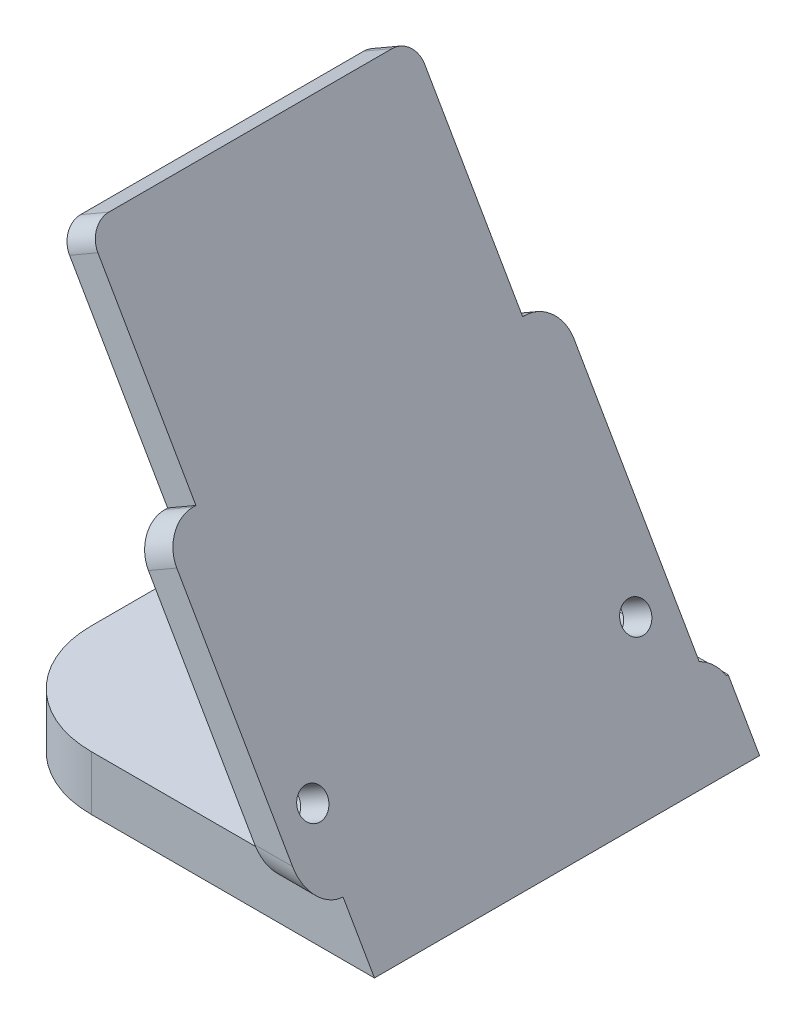
ISO-10303-21;
HEADER;
FILE_DESCRIPTION(('STEP AP214'),'2;1');
FILE_NAME('part.step','',(''),(''),'','','');
FILE_SCHEMA(('AUTOMOTIVE_DESIGN { 1 0 10303 214 1 1 1 1 }'));
ENDSEC;
DATA;
#1=APPLICATION_CONTEXT('core data for automotive mechanical design processes');
#2=APPLICATION_PROTOCOL_DEFINITION('international standard','automotive_design',2000,#1);
#3=PRODUCT_CONTEXT('',#1,'mechanical');
#4=PRODUCT('Part','Part','',(#3));
#5=PRODUCT_RELATED_PRODUCT_CATEGORY('part','',(#4));
#6=PRODUCT_DEFINITION_FORMATION('','',#4);
#7=PRODUCT_DEFINITION_CONTEXT('part definition',#1,'design');
#8=PRODUCT_DEFINITION('design','',#6,#7);
#9=PRODUCT_DEFINITION_SHAPE('','',#8);
#10=(LENGTH_UNIT() NAMED_UNIT(*) SI_UNIT(.MILLI.,.METRE.));
#11=(NAMED_UNIT(*) PLANE_ANGLE_UNIT() SI_UNIT($,.RADIAN.));
#12=(NAMED_UNIT(*) SI_UNIT($,.STERADIAN.) SOLID_ANGLE_UNIT());
#13=UNCERTAINTY_MEASURE_WITH_UNIT(LENGTH_MEASURE(1.E-05),#10,'distance_accuracy_value','');
#14=(GEOMETRIC_REPRESENTATION_CONTEXT(3) GLOBAL_UNCERTAINTY_ASSIGNED_CONTEXT((#13)) GLOBAL_UNIT_ASSIGNED_CONTEXT((#10,
#11,#12)) REPRESENTATION_CONTEXT('',''));
#15=CARTESIAN_POINT('',(0.,0.,0.));
#16=DIRECTION('',(0.,0.,1.));
#17=DIRECTION('',(1.,0.,0.));
#18=AXIS2_PLACEMENT_3D('',#15,#16,#17);
#19=CARTESIAN_POINT('',(-9.69486048327254,16.9770695124281,1.79143138002921));
#20=DIRECTION('',(0.,0.,1.));
#21=DIRECTION('',(0.,-1.,0.));
#22=AXIS2_PLACEMENT_3D('',#19,#20,#21);
#23=PLANE('',#22);
#24=DIRECTION('',(0.500000000000004,-0.866025403784436,0.));
#25=VECTOR('',#24,1.);
#26=CARTESIAN_POINT('',(-9.69486048327254,16.9770695124281,1.79143138002921));
#27=LINE('',#26,#25);
#28=CARTESIAN_POINT('',(-8.19486048327254,14.3789933010748,1.79143138002921));
#29=VERTEX_POINT('',#28);
#30=CARTESIAN_POINT('',(3.30513951672755,-5.53959098596728,1.79143138002921));
#31=VERTEX_POINT('',#30);
#32=EDGE_CURVE('E176',#29,#31,#27,.T.);
#33=ORIENTED_EDGE('',*,*,#32,.F.);
#34=DIRECTION('',(0.866025403784436,0.500000000000004,0.));
#35=VECTOR('',#34,1.);
#36=CARTESIAN_POINT('',(-8.19486048327253,14.3789933010748,1.79143138002921));
#37=LINE('',#36,#35);
#38=CARTESIAN_POINT('',(-5.59678427191923,15.8789933010748,1.79143138002921));
#39=VERTEX_POINT('',#38);
#40=EDGE_CURVE('E250',#29,#39,#37,.T.);
#41=ORIENTED_EDGE('',*,*,#40,.T.);
#42=DIRECTION('',(0.500000000000004,-0.866025403784436,0.));
#43=VECTOR('',#42,1.);
#44=CARTESIAN_POINT('',(-7.09678427191923,18.4770695124281,1.79143138002921));
#45=LINE('',#44,#43);
#46=CARTESIAN_POINT('',(5.90321572808086,-4.03959098596726,1.79143138002921));
#47=VERTEX_POINT('',#46);
#48=EDGE_CURVE('E187',#39,#47,#45,.T.);
#49=ORIENTED_EDGE('',*,*,#48,.T.);
#50=DIRECTION('',(-0.866025403784436,-0.500000000000004,0.));
#51=VECTOR('',#50,1.);
#52=CARTESIAN_POINT('',(5.90321572808086,-4.03959098596727,1.79143138002921));
#53=LINE('',#52,#51);
#54=EDGE_CURVE('E171',#47,#31,#53,.T.);
#55=ORIENTED_EDGE('',*,*,#54,.T.);
#56=EDGE_LOOP('',(#33,#41,#49,#55));
#57=FACE_BOUND('',#56,.T.);
#58=ADVANCED_FACE('F39',(#57),#23,.F.);
#59=CARTESIAN_POINT('',(-26.3440075221865,-10.5395909859673,40.));
#60=DIRECTION('',(0.,1.,0.));
#61=DIRECTION('',(-1.,0.,0.));
#62=AXIS2_PLACEMENT_3D('',#59,#60,#61);
#63=PLANE('',#62);
#64=CARTESIAN_POINT('',(-9.45824024729657,-10.5395909859673,3.52234221504846));
#65=DIRECTION('',(0.,-1.,0.));
#66=DIRECTION('',(0.,0.,-1.));
#67=AXIS2_PLACEMENT_3D('',#64,#65,#66);
#68=CIRCLE('',#67,1.32499999999999);
#69=CARTESIAN_POINT('',(-9.45824024729657,-10.5395909859673,2.19734221504847));
#70=VERTEX_POINT('',#69);
#71=EDGE_CURVE('E321',#70,#70,#68,.T.);
#72=ORIENTED_EDGE('',*,*,#71,.F.);
#73=EDGE_LOOP('',(#72));
#74=FACE_BOUND('',#73,.T.);
#75=DIRECTION('',(0.,0.,-1.));
#76=VECTOR('',#75,1.);
#77=CARTESIAN_POINT('',(-26.3440075221865,-10.5395909859673,40.));
#78=LINE('',#77,#76);
#79=CARTESIAN_POINT('',(-26.3440075221865,-10.5395909859673,25.3587554151698));
#80=VERTEX_POINT('',#79);
#81=CARTESIAN_POINT('',(-26.3440075221865,-10.5395909859673,10.));
#82=VERTEX_POINT('',#81);
#83=EDGE_CURVE('E211',#80,#82,#78,.T.);
#84=ORIENTED_EDGE('',*,*,#83,.T.);
#85=CARTESIAN_POINT('',(-16.3440075221865,-10.5395909859673,10.));
#86=DIRECTION('',(0.,1.,0.));
#87=DIRECTION('',(-1.,0.,0.));
#88=AXIS2_PLACEMENT_3D('',#85,#86,#87);
#89=CIRCLE('',#88,10.);
#90=CARTESIAN_POINT('',(-16.3440075221865,-10.5395909859673,0.));
#91=VERTEX_POINT('',#90);
#92=EDGE_CURVE('E239',#82,#91,#89,.F.);
#93=ORIENTED_EDGE('',*,*,#92,.T.);
#94=DIRECTION('',(1.,0.,0.));
#95=VECTOR('',#94,1.);
#96=CARTESIAN_POINT('',(-26.3440075221865,-10.5395909859673,0.));
#97=LINE('',#96,#95);
#98=CARTESIAN_POINT('',(9.65599247781348,-10.5395909859673,0.));
#99=VERTEX_POINT('',#98);
#100=EDGE_CURVE('E364',#91,#99,#97,.T.);
#101=ORIENTED_EDGE('',*,*,#100,.T.);
#102=DIRECTION('',(0.,0.,-1.));
#103=VECTOR('',#102,1.);
#104=CARTESIAN_POINT('',(9.65599247781348,-10.5395909859673,40.));
#105=LINE('',#104,#103);
#106=CARTESIAN_POINT('',(9.65599247781348,-10.5395909859673,35.3587554151698));
#107=VERTEX_POINT('',#106);
#108=EDGE_CURVE('E208',#107,#99,#105,.T.);
#109=ORIENTED_EDGE('',*,*,#108,.F.);
#110=DIRECTION('',(1.,0.,0.));
#111=VECTOR('',#110,1.);
#112=CARTESIAN_POINT('',(-26.3440075221865,-10.5395909859673,35.3587554151698));
#113=LINE('',#112,#111);
#114=CARTESIAN_POINT('',(-16.3440075221865,-10.5395909859673,35.3587554151698));
#115=VERTEX_POINT('',#114);
#116=EDGE_CURVE('E296',#115,#107,#113,.T.);
#117=ORIENTED_EDGE('',*,*,#116,.F.);
#118=CARTESIAN_POINT('',(-16.3440075221865,-10.5395909859673,25.3587554151698));
#119=DIRECTION('',(0.,1.,0.));
#120=DIRECTION('',(-1.,0.,0.));
#121=AXIS2_PLACEMENT_3D('',#118,#119,#120);
#122=CIRCLE('',#121,10.);
#123=EDGE_CURVE('E237',#115,#80,#122,.F.);
#124=ORIENTED_EDGE('',*,*,#123,.T.);
#125=EDGE_LOOP('',(#84,#93,#101,#109,#117,#124));
#126=FACE_BOUND('',#125,.T.);
#127=CARTESIAN_POINT('',(-2.45824024729657,-10.5395909859673,3.52234221504846));
#128=DIRECTION('',(0.,-1.,0.));
#129=DIRECTION('',(0.,0.,-1.));
#130=AXIS2_PLACEMENT_3D('',#127,#128,#129);
#131=CIRCLE('',#130,1.32499999999999);
#132=CARTESIAN_POINT('',(-2.45824024729657,-10.5395909859673,2.19734221504847));
#133=VERTEX_POINT('',#132);
#134=EDGE_CURVE('E309',#133,#133,#131,.T.);
#135=ORIENTED_EDGE('',*,*,#134,.F.);
#136=EDGE_LOOP('',(#135));
#137=FACE_BOUND('',#136,.T.);
#138=ADVANCED_FACE('F291',(#74,#126,#137),#63,.F.);
#139=CARTESIAN_POINT('',(-26.3440075221865,-5.53959098596729,40.));
#140=DIRECTION('',(1.,0.,0.));
#141=DIRECTION('',(0.,0.,-1.));
#142=AXIS2_PLACEMENT_3D('',#139,#140,#141);
#143=PLANE('',#142);
#144=DIRECTION('',(0.,0.,-1.));
#145=VECTOR('',#144,1.);
#146=CARTESIAN_POINT('',(-26.3440075221865,-5.53959098596729,40.));
#147=LINE('',#146,#145);
#148=CARTESIAN_POINT('',(-26.3440075221865,-5.53959098596729,25.3587554151698));
#149=VERTEX_POINT('',#148);
#150=CARTESIAN_POINT('',(-26.3440075221865,-5.53959098596729,10.));
#151=VERTEX_POINT('',#150);
#152=EDGE_CURVE('E197',#149,#151,#147,.T.);
#153=ORIENTED_EDGE('',*,*,#152,.T.);
#154=DIRECTION('',(0.,-1.,0.));
#155=VECTOR('',#154,1.);
#156=CARTESIAN_POINT('',(-26.3440075221865,-5.53959098596729,10.));
#157=LINE('',#156,#155);
#158=EDGE_CURVE('E234',#151,#82,#157,.T.);
#159=ORIENTED_EDGE('',*,*,#158,.T.);
#160=ORIENTED_EDGE('',*,*,#83,.F.);
#161=DIRECTION('',(0.,-1.,0.));
#162=VECTOR('',#161,1.);
#163=CARTESIAN_POINT('',(-26.3440075221865,-5.53959098596729,25.3587554151698));
#164=LINE('',#163,#162);
#165=EDGE_CURVE('E232',#80,#149,#164,.F.);
#166=ORIENTED_EDGE('',*,*,#165,.T.);
#167=EDGE_LOOP('',(#153,#159,#160,#166));
#168=FACE_BOUND('',#167,.T.);
#169=ADVANCED_FACE('F288',(#168),#143,.F.);
#170=CARTESIAN_POINT('',(9.65599247781348,-10.5395909859673,40.));
#171=DIRECTION('',(-0.866025403784436,-0.500000000000004,0.));
#172=DIRECTION('',(0.500000000000004,-0.866025403784436,0.));
#173=AXIS2_PLACEMENT_3D('',#170,#171,#172);
#174=PLANE('',#173);
#175=DIRECTION('',(-0.500000000000004,0.866025403784436,0.));
#176=VECTOR('',#175,1.);
#177=CARTESIAN_POINT('',(9.65599247781348,-10.5395909859673,0.));
#178=LINE('',#177,#176);
#179=CARTESIAN_POINT('',(6.76924113186532,-5.53959098596728,0.));
#180=VERTEX_POINT('',#179);
#181=EDGE_CURVE('E279',#99,#180,#178,.T.);
#182=ORIENTED_EDGE('',*,*,#181,.T.);
#183=DIRECTION('',(0.,0.,1.));
#184=VECTOR('',#183,1.);
#185=CARTESIAN_POINT('',(6.76924113186532,-5.53959098596728,40.));
#186=LINE('',#185,#184);
#187=CARTESIAN_POINT('',(6.76924113186532,-5.53959098596728,0.176467964167321));
#188=VERTEX_POINT('',#187);
#189=EDGE_CURVE('E47',#180,#188,#186,.T.);
#190=ORIENTED_EDGE('',*,*,#189,.T.);
#191=CARTESIAN_POINT('',(7.27611065221217,-6.41751474801608,3.));
#192=DIRECTION('',(-0.866025403784436,-0.500000000000004,0.));
#193=DIRECTION('',(0.500000000000004,-0.866025403784436,0.));
#194=AXIS2_PLACEMENT_3D('',#191,#192,#193);
#195=CIRCLE('',#194,3.);
#196=EDGE_CURVE('E172',#188,#47,#195,.F.);
#197=ORIENTED_EDGE('',*,*,#196,.T.);
#198=ORIENTED_EDGE('',*,*,#48,.F.);
#199=CARTESIAN_POINT('',(-5.59678427191923,15.8789933010748,4.79143138002921));
#200=DIRECTION('',(-0.866025403784436,-0.500000000000004,0.));
#201=DIRECTION('',(0.500000000000004,-0.866025403784436,0.));
#202=AXIS2_PLACEMENT_3D('',#199,#200,#201);
#203=CIRCLE('',#202,3.);
#204=CARTESIAN_POINT('',(-7.09678427191924,18.4770695124281,4.79143138002921));
#205=VERTEX_POINT('',#204);
#206=EDGE_CURVE('E255',#39,#205,#203,.F.);
#207=ORIENTED_EDGE('',*,*,#206,.T.);
#208=DIRECTION('',(0.,0.,-1.));
#209=VECTOR('',#208,1.);
#210=CARTESIAN_POINT('',(-7.09678427191924,18.4770695124281,0.));
#211=LINE('',#210,#209);
#212=CARTESIAN_POINT('',(-7.09678427191924,18.4770695124281,4.99999999999999));
#213=VERTEX_POINT('',#212);
#214=EDGE_CURVE('E346',#213,#205,#211,.T.);
#215=ORIENTED_EDGE('',*,*,#214,.F.);
#216=DIRECTION('',(0.500000000000004,-0.866025403784436,0.));
#217=VECTOR('',#216,1.);
#218=CARTESIAN_POINT('',(-17.0967842719193,35.7975775881168,5.));
#219=LINE('',#218,#217);
#220=CARTESIAN_POINT('',(-16.0967842719193,34.0655267805479,5.));
#221=VERTEX_POINT('',#220);
#222=EDGE_CURVE('E337',#221,#213,#219,.T.);
#223=ORIENTED_EDGE('',*,*,#222,.F.);
#224=CARTESIAN_POINT('',(-16.0967842719193,34.0655267805479,7.));
#225=DIRECTION('',(-0.866025403784436,-0.500000000000004,0.));
#226=DIRECTION('',(0.500000000000004,-0.866025403784436,0.));
#227=AXIS2_PLACEMENT_3D('',#224,#225,#226);
#228=CIRCLE('',#227,2.);
#229=CARTESIAN_POINT('',(-17.0967842719193,35.7975775881168,7.));
#230=VERTEX_POINT('',#229);
#231=EDGE_CURVE('E219',#221,#230,#228,.F.);
#232=ORIENTED_EDGE('',*,*,#231,.T.);
#233=DIRECTION('',(0.,0.,-1.));
#234=VECTOR('',#233,1.);
#235=CARTESIAN_POINT('',(-17.0967842719193,35.7975775881168,40.));
#236=LINE('',#235,#234);
#237=CARTESIAN_POINT('',(-17.0967842719193,35.7975775881168,33.));
#238=VERTEX_POINT('',#237);
#239=EDGE_CURVE('E200',#238,#230,#236,.T.);
#240=ORIENTED_EDGE('',*,*,#239,.F.);
#241=CARTESIAN_POINT('',(-16.0967842719193,34.0655267805479,33.));
#242=DIRECTION('',(-0.866025403784436,-0.500000000000004,0.));
#243=DIRECTION('',(0.500000000000004,-0.866025403784436,0.));
#244=AXIS2_PLACEMENT_3D('',#241,#242,#243);
#245=CIRCLE('',#244,2.);
#246=CARTESIAN_POINT('',(-16.0967842719193,34.0655267805479,35.));
#247=VERTEX_POINT('',#246);
#248=EDGE_CURVE('E217',#238,#247,#245,.F.);
#249=ORIENTED_EDGE('',*,*,#248,.T.);
#250=DIRECTION('',(-0.500000000000004,0.866025403784436,0.));
#251=VECTOR('',#250,1.);
#252=CARTESIAN_POINT('',(-17.0967842719193,35.7975775881168,35.));
#253=LINE('',#252,#251);
#254=CARTESIAN_POINT('',(-7.09678427191924,18.4770695124281,35.));
#255=VERTEX_POINT('',#254);
#256=EDGE_CURVE('E331',#255,#247,#253,.T.);
#257=ORIENTED_EDGE('',*,*,#256,.F.);
#258=DIRECTION('',(0.,0.,-1.));
#259=VECTOR('',#258,1.);
#260=CARTESIAN_POINT('',(-7.09678427191924,18.4770695124281,40.));
#261=LINE('',#260,#259);
#262=CARTESIAN_POINT('',(-7.09678427191924,18.4770695124281,35.2584726453722));
#263=VERTEX_POINT('',#262);
#264=EDGE_CURVE('E335',#263,#255,#261,.T.);
#265=ORIENTED_EDGE('',*,*,#264,.F.);
#266=CARTESIAN_POINT('',(-5.59678427191923,15.8789933010748,35.2584726453722));
#267=DIRECTION('',(-0.866025403784436,-0.500000000000004,0.));
#268=DIRECTION('',(0.500000000000004,-0.866025403784436,0.));
#269=AXIS2_PLACEMENT_3D('',#266,#267,#268);
#270=CIRCLE('',#269,3.);
#271=CARTESIAN_POINT('',(-5.59678427191923,15.8789933010748,38.2584726453722));
#272=VERTEX_POINT('',#271);
#273=EDGE_CURVE('E252',#263,#272,#270,.F.);
#274=ORIENTED_EDGE('',*,*,#273,.T.);
#275=DIRECTION('',(-0.500000000000004,0.866025403784436,0.));
#276=VECTOR('',#275,1.);
#277=CARTESIAN_POINT('',(-7.09678427191924,18.4770695124281,38.2584726453722));
#278=LINE('',#277,#276);
#279=CARTESIAN_POINT('',(5.03815829482546,-2.54126756010381,38.2584726453722));
#280=VERTEX_POINT('',#279);
#281=EDGE_CURVE('E186',#280,#272,#278,.T.);
#282=ORIENTED_EDGE('',*,*,#281,.F.);
#283=CARTESIAN_POINT('',(5.03815829482546,-2.54126756010381,35.2584726453722));
#284=DIRECTION('',(-0.866025403784436,-0.500000000000004,0.));
#285=DIRECTION('',(0.500000000000004,-0.866025403784436,0.));
#286=AXIS2_PLACEMENT_3D('',#283,#284,#285);
#287=ELLIPSE('',#286,3.46410161513776,3.);
#288=CARTESIAN_POINT('',(6.76924113186532,-5.53959098596729,35.3587554151698));
#289=VERTEX_POINT('',#288);
#290=EDGE_CURVE('E271',#280,#289,#287,.F.);
#291=ORIENTED_EDGE('',*,*,#290,.T.);
#292=DIRECTION('',(0.500000000000004,-0.866025403784436,0.));
#293=VECTOR('',#292,1.);
#294=CARTESIAN_POINT('',(9.65599247781348,-10.5395909859673,35.3587554151698));
#295=LINE('',#294,#293);
#296=EDGE_CURVE('E307',#289,#107,#295,.T.);
#297=ORIENTED_EDGE('',*,*,#296,.T.);
#298=ORIENTED_EDGE('',*,*,#108,.T.);
#299=EDGE_LOOP('',(#182,#190,#197,#198,#207,#215,#223,#232,#240,#249,#257,#265,#274,#282,#291,
#297,#298));
#300=FACE_BOUND('',#299,.T.);
#301=CARTESIAN_POINT('',(3.53817036558147,0.0567877440867891,5.25356261715988));
#302=DIRECTION('',(0.866025403784436,0.500000000000004,0.));
#303=DIRECTION('',(-0.500000000000004,0.866025403784436,0.));
#304=AXIS2_PLACEMENT_3D('',#301,#302,#303);
#305=CIRCLE('',#304,1.325);
#306=CARTESIAN_POINT('',(2.87567036558147,1.20427140410117,5.25356261715988));
#307=VERTEX_POINT('',#306);
#308=EDGE_CURVE('E358',#307,#307,#305,.T.);
#309=ORIENTED_EDGE('',*,*,#308,.F.);
#310=EDGE_LOOP('',(#309));
#311=FACE_BOUND('',#310,.T.);
#312=CARTESIAN_POINT('',(3.53817036558147,0.0567877440867891,34.9035626171599));
#313=DIRECTION('',(0.866025403784436,0.500000000000004,0.));
#314=DIRECTION('',(-0.500000000000004,0.866025403784436,0.));
#315=AXIS2_PLACEMENT_3D('',#312,#313,#314);
#316=CIRCLE('',#315,1.325);
#317=CARTESIAN_POINT('',(2.87567036558147,1.20427140410117,34.9035626171599));
#318=VERTEX_POINT('',#317);
#319=EDGE_CURVE('E342',#318,#318,#316,.T.);
#320=ORIENTED_EDGE('',*,*,#319,.F.);
#321=EDGE_LOOP('',(#320));
#322=FACE_BOUND('',#321,.T.);
#323=ADVANCED_FACE('F277',(#300,#311,#322),#174,.F.);
#324=CARTESIAN_POINT('',(-17.0967842719193,35.7975775881168,40.));
#325=DIRECTION('',(0.500000000000003,-0.866025403784437,0.));
#326=DIRECTION('',(0.866025403784437,0.500000000000003,0.));
#327=AXIS2_PLACEMENT_3D('',#324,#325,#326);
#328=PLANE('',#327);
#329=ORIENTED_EDGE('',*,*,#239,.T.);
#330=DIRECTION('',(0.866025403784437,0.500000000000003,0.));
#331=VECTOR('',#330,1.);
#332=CARTESIAN_POINT('',(-17.0967842719193,35.7975775881168,7.));
#333=LINE('',#332,#331);
#334=CARTESIAN_POINT('',(-19.6948604832726,34.2975775881168,7.));
#335=VERTEX_POINT('',#334);
#336=EDGE_CURVE('E224',#230,#335,#333,.F.);
#337=ORIENTED_EDGE('',*,*,#336,.T.);
#338=DIRECTION('',(0.,0.,-1.));
#339=VECTOR('',#338,1.);
#340=CARTESIAN_POINT('',(-19.6948604832726,34.2975775881168,40.));
#341=LINE('',#340,#339);
#342=CARTESIAN_POINT('',(-19.6948604832726,34.2975775881168,33.));
#343=VERTEX_POINT('',#342);
#344=EDGE_CURVE('E196',#343,#335,#341,.T.);
#345=ORIENTED_EDGE('',*,*,#344,.F.);
#346=DIRECTION('',(0.866025403784437,0.500000000000003,0.));
#347=VECTOR('',#346,1.);
#348=CARTESIAN_POINT('',(-17.0967842719193,35.7975775881168,33.));
#349=LINE('',#348,#347);
#350=EDGE_CURVE('E221',#343,#238,#349,.T.);
#351=ORIENTED_EDGE('',*,*,#350,.T.);
#352=EDGE_LOOP('',(#329,#337,#345,#351));
#353=FACE_BOUND('',#352,.T.);
#354=ADVANCED_FACE('F430',(#353),#328,.F.);
#355=CARTESIAN_POINT('',(-19.6948604832726,34.2975775881168,40.));
#356=DIRECTION('',(0.866025403784436,0.500000000000004,0.));
#357=DIRECTION('',(-0.500000000000004,0.866025403784436,0.));
#358=AXIS2_PLACEMENT_3D('',#355,#356,#357);
#359=PLANE('',#358);
#360=CARTESIAN_POINT('',(0.94009415422817,-1.44321225591322,34.9035626171599));
#361=DIRECTION('',(0.866025403784436,0.500000000000004,0.));
#362=DIRECTION('',(-0.500000000000004,0.866025403784436,0.));
#363=AXIS2_PLACEMENT_3D('',#360,#361,#362);
#364=CIRCLE('',#363,1.325);
#365=CARTESIAN_POINT('',(0.277594154228164,-0.295728595898841,34.9035626171599));
#366=VERTEX_POINT('',#365);
#367=EDGE_CURVE('E355',#366,#366,#364,.T.);
#368=ORIENTED_EDGE('',*,*,#367,.T.);
#369=EDGE_LOOP('',(#368));
#370=FACE_BOUND('',#369,.T.);
#371=CARTESIAN_POINT('',(0.94009415422817,-1.44321225591322,5.25356261715988));
#372=DIRECTION('',(0.866025403784436,0.500000000000004,0.));
#373=DIRECTION('',(-0.500000000000004,0.866025403784436,0.));
#374=AXIS2_PLACEMENT_3D('',#371,#372,#373);
#375=CIRCLE('',#374,1.325);
#376=CARTESIAN_POINT('',(0.277594154228165,-0.295728595898841,5.25356261715988));
#377=VERTEX_POINT('',#376);
#378=EDGE_CURVE('E361',#377,#377,#375,.T.);
#379=ORIENTED_EDGE('',*,*,#378,.T.);
#380=EDGE_LOOP('',(#379));
#381=FACE_BOUND('',#380,.T.);
#382=DIRECTION('',(0.,0.,-1.));
#383=VECTOR('',#382,1.);
#384=CARTESIAN_POINT('',(3.30513951672756,-5.53959098596728,40.));
#385=LINE('',#384,#383);
#386=CARTESIAN_POINT('',(3.30513951672757,-5.53959098596729,35.3587554151698));
#387=VERTEX_POINT('',#386);
#388=EDGE_CURVE('E178',#387,#31,#385,.T.);
#389=ORIENTED_EDGE('',*,*,#388,.F.);
#390=CARTESIAN_POINT('',(1.5740566796877,-2.54126756010381,35.2584726453722));
#391=DIRECTION('',(0.866025403784436,0.500000000000004,0.));
#392=DIRECTION('',(0.500000000000004,-0.866025403784436,0.));
#393=AXIS2_PLACEMENT_3D('',#390,#391,#392);
#394=ELLIPSE('',#393,3.46410161513776,3.);
#395=CARTESIAN_POINT('',(1.5740566796877,-2.54126756010381,38.2584726453722));
#396=VERTEX_POINT('',#395);
#397=EDGE_CURVE('E273',#387,#396,#394,.F.);
#398=ORIENTED_EDGE('',*,*,#397,.T.);
#399=DIRECTION('',(-0.500000000000004,0.866025403784436,0.));
#400=VECTOR('',#399,1.);
#401=CARTESIAN_POINT('',(-9.69486048327255,16.9770695124281,38.2584726453722));
#402=LINE('',#401,#400);
#403=CARTESIAN_POINT('',(-8.19486048327254,14.3789933010748,38.2584726453722));
#404=VERTEX_POINT('',#403);
#405=EDGE_CURVE('E314',#396,#404,#402,.T.);
#406=ORIENTED_EDGE('',*,*,#405,.T.);
#407=CARTESIAN_POINT('',(-8.19486048327253,14.3789933010748,35.2584726453722));
#408=DIRECTION('',(0.866025403784436,0.500000000000004,0.));
#409=DIRECTION('',(-0.500000000000004,0.866025403784436,0.));
#410=AXIS2_PLACEMENT_3D('',#407,#408,#409);
#411=CIRCLE('',#410,3.);
#412=CARTESIAN_POINT('',(-9.69486048327255,16.9770695124281,35.2584726453722));
#413=VERTEX_POINT('',#412);
#414=EDGE_CURVE('E259',#404,#413,#411,.F.);
#415=ORIENTED_EDGE('',*,*,#414,.T.);
#416=DIRECTION('',(0.,0.,-1.));
#417=VECTOR('',#416,1.);
#418=CARTESIAN_POINT('',(-9.69486048327255,16.9770695124281,40.));
#419=LINE('',#418,#417);
#420=CARTESIAN_POINT('',(-9.69486048327255,16.9770695124281,35.));
#421=VERTEX_POINT('',#420);
#422=EDGE_CURVE('E328',#413,#421,#419,.T.);
#423=ORIENTED_EDGE('',*,*,#422,.T.);
#424=DIRECTION('',(-0.500000000000004,0.866025403784436,0.));
#425=VECTOR('',#424,1.);
#426=CARTESIAN_POINT('',(-19.6948604832726,34.2975775881168,35.));
#427=LINE('',#426,#425);
#428=CARTESIAN_POINT('',(-18.6948604832726,32.5655267805479,35.));
#429=VERTEX_POINT('',#428);
#430=EDGE_CURVE('E330',#421,#429,#427,.T.);
#431=ORIENTED_EDGE('',*,*,#430,.T.);
#432=CARTESIAN_POINT('',(-18.6948604832726,32.5655267805479,33.));
#433=DIRECTION('',(0.866025403784436,0.500000000000004,0.));
#434=DIRECTION('',(-0.500000000000004,0.866025403784436,0.));
#435=AXIS2_PLACEMENT_3D('',#432,#433,#434);
#436=CIRCLE('',#435,2.);
#437=EDGE_CURVE('E226',#429,#343,#436,.F.);
#438=ORIENTED_EDGE('',*,*,#437,.T.);
#439=ORIENTED_EDGE('',*,*,#344,.T.);
#440=CARTESIAN_POINT('',(-18.6948604832726,32.5655267805479,7.));
#441=DIRECTION('',(0.866025403784436,0.500000000000004,0.));
#442=DIRECTION('',(-0.500000000000004,0.866025403784436,0.));
#443=AXIS2_PLACEMENT_3D('',#440,#441,#442);
#444=CIRCLE('',#443,2.);
#445=CARTESIAN_POINT('',(-18.6948604832726,32.5655267805479,5.));
#446=VERTEX_POINT('',#445);
#447=EDGE_CURVE('E228',#335,#446,#444,.F.);
#448=ORIENTED_EDGE('',*,*,#447,.T.);
#449=DIRECTION('',(0.500000000000004,-0.866025403784436,0.));
#450=VECTOR('',#449,1.);
#451=CARTESIAN_POINT('',(-19.6948604832726,34.2975775881168,5.));
#452=LINE('',#451,#450);
#453=CARTESIAN_POINT('',(-9.69486048327255,16.9770695124281,4.99999999999999));
#454=VERTEX_POINT('',#453);
#455=EDGE_CURVE('E349',#446,#454,#452,.T.);
#456=ORIENTED_EDGE('',*,*,#455,.T.);
#457=DIRECTION('',(0.,0.,-1.));
#458=VECTOR('',#457,1.);
#459=CARTESIAN_POINT('',(-9.69486048327255,16.9770695124281,0.));
#460=LINE('',#459,#458);
#461=CARTESIAN_POINT('',(-9.69486048327255,16.9770695124281,4.79143138002921));
#462=VERTEX_POINT('',#461);
#463=EDGE_CURVE('E345',#454,#462,#460,.T.);
#464=ORIENTED_EDGE('',*,*,#463,.T.);
#465=CARTESIAN_POINT('',(-8.19486048327254,14.3789933010748,4.79143138002921));
#466=DIRECTION('',(0.866025403784436,0.500000000000004,0.));
#467=DIRECTION('',(-0.500000000000004,0.866025403784436,0.));
#468=AXIS2_PLACEMENT_3D('',#465,#466,#467);
#469=CIRCLE('',#468,3.);
#470=EDGE_CURVE('E182',#462,#29,#469,.F.);
#471=ORIENTED_EDGE('',*,*,#470,.T.);
#472=ORIENTED_EDGE('',*,*,#32,.T.);
#473=EDGE_LOOP('',(#389,#398,#406,#415,#423,#431,#438,#439,#448,#456,#464,#471,#472));
#474=FACE_BOUND('',#473,.T.);
#475=ADVANCED_FACE('F177',(#370,#381,#474),#359,.F.);
#476=CARTESIAN_POINT('',(3.30513951672756,-5.53959098596728,40.));
#477=DIRECTION('',(0.,-1.,0.));
#478=DIRECTION('',(1.,0.,0.));
#479=AXIS2_PLACEMENT_3D('',#476,#477,#478);
#480=PLANE('',#479);
#481=CARTESIAN_POINT('',(-2.45824024729657,-5.53959098596728,3.52234221504846));
#482=DIRECTION('',(0.,-1.,0.));
#483=DIRECTION('',(1.,0.,0.));
#484=AXIS2_PLACEMENT_3D('',#481,#482,#483);
#485=CIRCLE('',#484,1.32499999999999);
#486=CARTESIAN_POINT('',(-1.13324024729658,-5.53959098596728,3.52234221504846));
#487=VERTEX_POINT('',#486);
#488=EDGE_CURVE('E318',#487,#487,#485,.T.);
#489=ORIENTED_EDGE('',*,*,#488,.T.);
#490=EDGE_LOOP('',(#489));
#491=FACE_BOUND('',#490,.T.);
#492=CARTESIAN_POINT('',(-9.45824024729657,-5.53959098596729,3.52234221504846));
#493=DIRECTION('',(0.,-1.,0.));
#494=DIRECTION('',(1.,0.,0.));
#495=AXIS2_PLACEMENT_3D('',#492,#493,#494);
#496=CIRCLE('',#495,1.32499999999999);
#497=CARTESIAN_POINT('',(-8.13324024729658,-5.53959098596729,3.52234221504846));
#498=VERTEX_POINT('',#497);
#499=EDGE_CURVE('E324',#498,#498,#496,.T.);
#500=ORIENTED_EDGE('',*,*,#499,.T.);
#501=EDGE_LOOP('',(#500));
#502=FACE_BOUND('',#501,.T.);
#503=DIRECTION('',(-1.,0.,0.));
#504=VECTOR('',#503,1.);
#505=CARTESIAN_POINT('',(3.30513951672756,-5.53959098596728,0.));
#506=LINE('',#505,#504);
#507=CARTESIAN_POINT('',(-16.3440075221865,-5.53959098596729,0.));
#508=VERTEX_POINT('',#507);
#509=EDGE_CURVE('E54',#180,#508,#506,.T.);
#510=ORIENTED_EDGE('',*,*,#509,.T.);
#511=CARTESIAN_POINT('',(-16.3440075221865,-5.53959098596729,10.));
#512=DIRECTION('',(0.,-1.,0.));
#513=DIRECTION('',(1.,0.,0.));
#514=AXIS2_PLACEMENT_3D('',#511,#512,#513);
#515=CIRCLE('',#514,10.);
#516=EDGE_CURVE('E245',#508,#151,#515,.F.);
#517=ORIENTED_EDGE('',*,*,#516,.T.);
#518=ORIENTED_EDGE('',*,*,#152,.F.);
#519=CARTESIAN_POINT('',(-16.3440075221865,-5.53959098596729,25.3587554151698));
#520=DIRECTION('',(0.,-1.,0.));
#521=DIRECTION('',(1.,0.,0.));
#522=AXIS2_PLACEMENT_3D('',#519,#520,#521);
#523=CIRCLE('',#522,10.);
#524=CARTESIAN_POINT('',(-16.3440075221865,-5.53959098596729,35.3587554151698));
#525=VERTEX_POINT('',#524);
#526=EDGE_CURVE('E243',#149,#525,#523,.F.);
#527=ORIENTED_EDGE('',*,*,#526,.T.);
#528=DIRECTION('',(1.,0.,0.));
#529=VECTOR('',#528,1.);
#530=CARTESIAN_POINT('',(-26.3440075221865,-5.53959098596729,35.3587554151698));
#531=LINE('',#530,#529);
#532=EDGE_CURVE('E194',#525,#387,#531,.T.);
#533=ORIENTED_EDGE('',*,*,#532,.T.);
#534=ORIENTED_EDGE('',*,*,#388,.T.);
#535=CARTESIAN_POINT('',(8.79671921325269,-5.53959098596728,3.));
#536=DIRECTION('',(0.,-1.,0.));
#537=DIRECTION('',(-1.,0.,0.));
#538=AXIS2_PLACEMENT_3D('',#535,#536,#537);
#539=ELLIPSE('',#538,5.99999999999995,3.);
#540=EDGE_CURVE('E11',#31,#188,#539,.T.);
#541=ORIENTED_EDGE('',*,*,#540,.T.);
#542=ORIENTED_EDGE('',*,*,#189,.F.);
#543=EDGE_LOOP('',(#510,#517,#518,#527,#533,#534,#541,#542));
#544=FACE_BOUND('',#543,.T.);
#545=ADVANCED_FACE('F192',(#491,#502,#544),#480,.F.);
#546=CARTESIAN_POINT('',(0.,0.,0.));
#547=DIRECTION('',(0.,0.,1.));
#548=DIRECTION('',(1.,0.,0.));
#549=AXIS2_PLACEMENT_3D('',#546,#547,#548);
#550=PLANE('',#549);
#551=ORIENTED_EDGE('',*,*,#509,.F.);
#552=ORIENTED_EDGE('',*,*,#181,.F.);
#553=ORIENTED_EDGE('',*,*,#100,.F.);
#554=DIRECTION('',(0.,-1.,0.));
#555=VECTOR('',#554,1.);
#556=CARTESIAN_POINT('',(-16.3440075221865,0.,0.));
#557=LINE('',#556,#555);
#558=EDGE_CURVE('E241',#91,#508,#557,.F.);
#559=ORIENTED_EDGE('',*,*,#558,.T.);
#560=EDGE_LOOP('',(#551,#552,#553,#559));
#561=FACE_BOUND('',#560,.T.);
#562=ADVANCED_FACE('F366',(#561),#550,.F.);
#563=CARTESIAN_POINT('',(3.53817036558147,0.0567877440867891,5.25356261715988));
#564=DIRECTION('',(0.866025403784436,0.500000000000004,0.));
#565=DIRECTION('',(-0.500000000000004,0.866025403784436,0.));
#566=AXIS2_PLACEMENT_3D('',#563,#564,#565);
#567=CYLINDRICAL_SURFACE('',#566,1.325);
#568=ORIENTED_EDGE('',*,*,#378,.F.);
#569=EDGE_LOOP('',(#568));
#570=FACE_BOUND('',#569,.T.);
#571=ORIENTED_EDGE('',*,*,#308,.T.);
#572=EDGE_LOOP('',(#571));
#573=FACE_BOUND('',#572,.T.);
#574=ADVANCED_FACE('F368',(#570,#573),#567,.F.);
#575=CARTESIAN_POINT('',(3.53817036558147,0.0567877440867891,34.9035626171599));
#576=DIRECTION('',(0.866025403784436,0.500000000000004,0.));
#577=DIRECTION('',(-0.500000000000004,0.866025403784436,0.));
#578=AXIS2_PLACEMENT_3D('',#575,#576,#577);
#579=CYLINDRICAL_SURFACE('',#578,1.325);
#580=ORIENTED_EDGE('',*,*,#367,.F.);
#581=EDGE_LOOP('',(#580));
#582=FACE_BOUND('',#581,.T.);
#583=ORIENTED_EDGE('',*,*,#319,.T.);
#584=EDGE_LOOP('',(#583));
#585=FACE_BOUND('',#584,.T.);
#586=ADVANCED_FACE('F375',(#582,#585),#579,.F.);
#587=CARTESIAN_POINT('',(-9.69486048327255,16.9770695124281,0.));
#588=DIRECTION('',(0.500000000000004,-0.866025403784436,0.));
#589=DIRECTION('',(0.866025403784436,0.500000000000004,0.));
#590=AXIS2_PLACEMENT_3D('',#587,#588,#589);
#591=PLANE('',#590);
#592=ORIENTED_EDGE('',*,*,#214,.T.);
#593=DIRECTION('',(0.866025403784436,0.500000000000004,0.));
#594=VECTOR('',#593,1.);
#595=CARTESIAN_POINT('',(-9.69486048327255,16.9770695124281,4.79143138002921));
#596=LINE('',#595,#594);
#597=EDGE_CURVE('E257',#205,#462,#596,.F.);
#598=ORIENTED_EDGE('',*,*,#597,.T.);
#599=ORIENTED_EDGE('',*,*,#463,.F.);
#600=DIRECTION('',(0.866025403784436,0.500000000000004,0.));
#601=VECTOR('',#600,1.);
#602=CARTESIAN_POINT('',(-9.69486048327255,16.9770695124281,4.99999999999999));
#603=LINE('',#602,#601);
#604=EDGE_CURVE('E327',#454,#213,#603,.T.);
#605=ORIENTED_EDGE('',*,*,#604,.T.);
#606=EDGE_LOOP('',(#592,#598,#599,#605));
#607=FACE_BOUND('',#606,.T.);
#608=ADVANCED_FACE('F417',(#607),#591,.F.);
#609=CARTESIAN_POINT('',(-19.6948604832726,34.2975775881168,5.));
#610=DIRECTION('',(0.,0.,1.));
#611=DIRECTION('',(0.,-1.,0.));
#612=AXIS2_PLACEMENT_3D('',#609,#610,#611);
#613=PLANE('',#612);
#614=ORIENTED_EDGE('',*,*,#455,.F.);
#615=DIRECTION('',(0.866025403784437,0.500000000000003,0.));
#616=VECTOR('',#615,1.);
#617=CARTESIAN_POINT('',(-18.6948604832726,32.5655267805479,5.));
#618=LINE('',#617,#616);
#619=EDGE_CURVE('E214',#446,#221,#618,.T.);
#620=ORIENTED_EDGE('',*,*,#619,.T.);
#621=ORIENTED_EDGE('',*,*,#222,.T.);
#622=ORIENTED_EDGE('',*,*,#604,.F.);
#623=EDGE_LOOP('',(#614,#620,#621,#622));
#624=FACE_BOUND('',#623,.T.);
#625=ADVANCED_FACE('F410',(#624),#613,.F.);
#626=CARTESIAN_POINT('',(-19.6948604832726,34.2975775881168,35.));
#627=DIRECTION('',(0.,0.,-1.));
#628=DIRECTION('',(-1.,0.,0.));
#629=AXIS2_PLACEMENT_3D('',#626,#627,#628);
#630=PLANE('',#629);
#631=ORIENTED_EDGE('',*,*,#256,.T.);
#632=DIRECTION('',(0.866025403784437,0.500000000000003,0.));
#633=VECTOR('',#632,1.);
#634=CARTESIAN_POINT('',(-18.6948604832726,32.5655267805479,35.));
#635=LINE('',#634,#633);
#636=EDGE_CURVE('E230',#247,#429,#635,.F.);
#637=ORIENTED_EDGE('',*,*,#636,.T.);
#638=ORIENTED_EDGE('',*,*,#430,.F.);
#639=DIRECTION('',(0.866025403784436,0.500000000000004,0.));
#640=VECTOR('',#639,1.);
#641=CARTESIAN_POINT('',(-9.69486048327255,16.9770695124281,35.));
#642=LINE('',#641,#640);
#643=EDGE_CURVE('E334',#421,#255,#642,.T.);
#644=ORIENTED_EDGE('',*,*,#643,.T.);
#645=EDGE_LOOP('',(#631,#637,#638,#644));
#646=FACE_BOUND('',#645,.T.);
#647=ADVANCED_FACE('F407',(#646),#630,.F.);
#648=CARTESIAN_POINT('',(-9.69486048327255,16.9770695124281,40.));
#649=DIRECTION('',(0.500000000000004,-0.866025403784436,0.));
#650=DIRECTION('',(0.866025403784436,0.500000000000004,0.));
#651=AXIS2_PLACEMENT_3D('',#648,#649,#650);
#652=PLANE('',#651);
#653=ORIENTED_EDGE('',*,*,#422,.F.);
#654=DIRECTION('',(0.866025403784436,0.500000000000004,0.));
#655=VECTOR('',#654,1.);
#656=CARTESIAN_POINT('',(-9.69486048327255,16.9770695124281,35.2584726453722));
#657=LINE('',#656,#655);
#658=EDGE_CURVE('E262',#413,#263,#657,.T.);
#659=ORIENTED_EDGE('',*,*,#658,.T.);
#660=ORIENTED_EDGE('',*,*,#264,.T.);
#661=ORIENTED_EDGE('',*,*,#643,.F.);
#662=EDGE_LOOP('',(#653,#659,#660,#661));
#663=FACE_BOUND('',#662,.T.);
#664=ADVANCED_FACE('F405',(#663),#652,.F.);
#665=CARTESIAN_POINT('',(-9.45824024729657,-10.5395909859673,3.52234221504846));
#666=DIRECTION('',(0.,-1.,0.));
#667=DIRECTION('',(0.,0.,-1.));
#668=AXIS2_PLACEMENT_3D('',#665,#666,#667);
#669=CYLINDRICAL_SURFACE('',#668,1.32499999999999);
#670=ORIENTED_EDGE('',*,*,#499,.F.);
#671=EDGE_LOOP('',(#670));
#672=FACE_BOUND('',#671,.T.);
#673=ORIENTED_EDGE('',*,*,#71,.T.);
#674=EDGE_LOOP('',(#673));
#675=FACE_BOUND('',#674,.T.);
#676=ADVANCED_FACE('F401',(#672,#675),#669,.F.);
#677=CARTESIAN_POINT('',(-2.45824024729657,-10.5395909859673,3.52234221504846));
#678=DIRECTION('',(0.,-1.,0.));
#679=DIRECTION('',(0.,0.,-1.));
#680=AXIS2_PLACEMENT_3D('',#677,#678,#679);
#681=CYLINDRICAL_SURFACE('',#680,1.32499999999999);
#682=ORIENTED_EDGE('',*,*,#488,.F.);
#683=EDGE_LOOP('',(#682));
#684=FACE_BOUND('',#683,.T.);
#685=ORIENTED_EDGE('',*,*,#134,.T.);
#686=EDGE_LOOP('',(#685));
#687=FACE_BOUND('',#686,.T.);
#688=ADVANCED_FACE('F397',(#684,#687),#681,.F.);
#689=CARTESIAN_POINT('',(-18.6948604832726,32.5655267805479,7.));
#690=DIRECTION('',(0.866025403784437,0.500000000000003,0.));
#691=DIRECTION('',(-0.500000000000003,0.866025403784437,0.));
#692=AXIS2_PLACEMENT_3D('',#689,#690,#691);
#693=CYLINDRICAL_SURFACE('',#692,2.);
#694=ORIENTED_EDGE('',*,*,#447,.F.);
#695=ORIENTED_EDGE('',*,*,#336,.F.);
#696=ORIENTED_EDGE('',*,*,#231,.F.);
#697=ORIENTED_EDGE('',*,*,#619,.F.);
#698=EDGE_LOOP('',(#694,#695,#696,#697));
#699=FACE_BOUND('',#698,.T.);
#700=ADVANCED_FACE('F400',(#699),#693,.T.);
#701=CARTESIAN_POINT('',(-16.0967842719193,34.0655267805479,33.));
#702=DIRECTION('',(0.866025403784437,0.500000000000003,0.));
#703=DIRECTION('',(-0.500000000000003,0.866025403784437,0.));
#704=AXIS2_PLACEMENT_3D('',#701,#702,#703);
#705=CYLINDRICAL_SURFACE('',#704,2.);
#706=ORIENTED_EDGE('',*,*,#437,.F.);
#707=ORIENTED_EDGE('',*,*,#636,.F.);
#708=ORIENTED_EDGE('',*,*,#248,.F.);
#709=ORIENTED_EDGE('',*,*,#350,.F.);
#710=EDGE_LOOP('',(#706,#707,#708,#709));
#711=FACE_BOUND('',#710,.T.);
#712=ADVANCED_FACE('F396',(#711),#705,.T.);
#713=CARTESIAN_POINT('',(-26.3440075221865,-5.53959098596729,35.3587554151698));
#714=DIRECTION('',(0.,0.,-1.));
#715=DIRECTION('',(-1.,0.,0.));
#716=AXIS2_PLACEMENT_3D('',#713,#714,#715);
#717=PLANE('',#716);
#718=ORIENTED_EDGE('',*,*,#532,.F.);
#719=DIRECTION('',(0.,-1.,0.));
#720=VECTOR('',#719,1.);
#721=CARTESIAN_POINT('',(-16.3440075221865,-5.53959098596729,35.3587554151698));
#722=LINE('',#721,#720);
#723=EDGE_CURVE('E247',#525,#115,#722,.T.);
#724=ORIENTED_EDGE('',*,*,#723,.T.);
#725=ORIENTED_EDGE('',*,*,#116,.T.);
#726=ORIENTED_EDGE('',*,*,#296,.F.);
#727=EDGE_CURVE('E306',#387,#289,#531,.T.);
#728=ORIENTED_EDGE('',*,*,#727,.F.);
#729=EDGE_LOOP('',(#718,#724,#725,#726,#728));
#730=FACE_BOUND('',#729,.T.);
#731=ADVANCED_FACE('F302',(#730),#717,.F.);
#732=CARTESIAN_POINT('',(-9.69486048327255,16.9770695124281,38.2584726453722));
#733=DIRECTION('',(0.,0.,-1.));
#734=DIRECTION('',(-1.,0.,0.));
#735=AXIS2_PLACEMENT_3D('',#732,#733,#734);
#736=PLANE('',#735);
#737=ORIENTED_EDGE('',*,*,#405,.F.);
#738=DIRECTION('',(1.,0.,0.));
#739=VECTOR('',#738,1.);
#740=CARTESIAN_POINT('',(-9.69486048327254,-2.54126756010381,38.2584726453722));
#741=LINE('',#740,#739);
#742=EDGE_CURVE('E268',#396,#280,#741,.T.);
#743=ORIENTED_EDGE('',*,*,#742,.T.);
#744=ORIENTED_EDGE('',*,*,#281,.T.);
#745=DIRECTION('',(0.866025403784436,0.500000000000004,0.));
#746=VECTOR('',#745,1.);
#747=CARTESIAN_POINT('',(-8.19486048327254,14.3789933010748,38.2584726453722));
#748=LINE('',#747,#746);
#749=EDGE_CURVE('E265',#272,#404,#748,.F.);
#750=ORIENTED_EDGE('',*,*,#749,.T.);
#751=EDGE_LOOP('',(#737,#743,#744,#750));
#752=FACE_BOUND('',#751,.T.);
#753=ADVANCED_FACE('F390',(#752),#736,.F.);
#754=CARTESIAN_POINT('',(-16.3440075221865,-5.53959098596729,10.));
#755=DIRECTION('',(0.,-1.,0.));
#756=DIRECTION('',(0.,0.,-1.));
#757=AXIS2_PLACEMENT_3D('',#754,#755,#756);
#758=CYLINDRICAL_SURFACE('',#757,10.);
#759=ORIENTED_EDGE('',*,*,#516,.F.);
#760=ORIENTED_EDGE('',*,*,#558,.F.);
#761=ORIENTED_EDGE('',*,*,#92,.F.);
#762=ORIENTED_EDGE('',*,*,#158,.F.);
#763=EDGE_LOOP('',(#759,#760,#761,#762));
#764=FACE_BOUND('',#763,.T.);
#765=ADVANCED_FACE('F285',(#764),#758,.T.);
#766=CARTESIAN_POINT('',(-16.3440075221865,-5.53959098596729,25.3587554151698));
#767=DIRECTION('',(0.,-1.,0.));
#768=DIRECTION('',(0.,0.,-1.));
#769=AXIS2_PLACEMENT_3D('',#766,#767,#768);
#770=CYLINDRICAL_SURFACE('',#769,10.);
#771=ORIENTED_EDGE('',*,*,#526,.F.);
#772=ORIENTED_EDGE('',*,*,#165,.F.);
#773=ORIENTED_EDGE('',*,*,#123,.F.);
#774=ORIENTED_EDGE('',*,*,#723,.F.);
#775=EDGE_LOOP('',(#771,#772,#773,#774));
#776=FACE_BOUND('',#775,.T.);
#777=ADVANCED_FACE('F300',(#776),#770,.T.);
#778=CARTESIAN_POINT('',(-8.19486048327253,14.3789933010748,4.79143138002921));
#779=DIRECTION('',(0.866025403784436,0.500000000000004,0.));
#780=DIRECTION('',(-0.500000000000004,0.866025403784436,0.));
#781=AXIS2_PLACEMENT_3D('',#778,#779,#780);
#782=CYLINDRICAL_SURFACE('',#781,3.);
#783=ORIENTED_EDGE('',*,*,#470,.F.);
#784=ORIENTED_EDGE('',*,*,#597,.F.);
#785=ORIENTED_EDGE('',*,*,#206,.F.);
#786=ORIENTED_EDGE('',*,*,#40,.F.);
#787=EDGE_LOOP('',(#783,#784,#785,#786));
#788=FACE_BOUND('',#787,.T.);
#789=ADVANCED_FACE('F452',(#788),#782,.T.);
#790=CARTESIAN_POINT('',(-8.19486048327254,14.3789933010748,35.2584726453722));
#791=DIRECTION('',(0.866025403784436,0.500000000000004,0.));
#792=DIRECTION('',(-0.500000000000004,0.866025403784436,0.));
#793=AXIS2_PLACEMENT_3D('',#790,#791,#792);
#794=CYLINDRICAL_SURFACE('',#793,3.);
#795=ORIENTED_EDGE('',*,*,#414,.F.);
#796=ORIENTED_EDGE('',*,*,#749,.F.);
#797=ORIENTED_EDGE('',*,*,#273,.F.);
#798=ORIENTED_EDGE('',*,*,#658,.F.);
#799=EDGE_LOOP('',(#795,#796,#797,#798));
#800=FACE_BOUND('',#799,.T.);
#801=ADVANCED_FACE('F455',(#800),#794,.T.);
#802=CARTESIAN_POINT('',(0.,-2.54126756010381,35.2584726453722));
#803=DIRECTION('',(1.,0.,0.));
#804=DIRECTION('',(0.,1.,0.));
#805=AXIS2_PLACEMENT_3D('',#802,#803,#804);
#806=CYLINDRICAL_SURFACE('',#805,3.);
#807=ORIENTED_EDGE('',*,*,#397,.F.);
#808=ORIENTED_EDGE('',*,*,#727,.T.);
#809=ORIENTED_EDGE('',*,*,#290,.F.);
#810=ORIENTED_EDGE('',*,*,#742,.F.);
#811=EDGE_LOOP('',(#807,#808,#809,#810));
#812=FACE_BOUND('',#811,.T.);
#813=ADVANCED_FACE('F458',(#812),#806,.T.);
#814=CARTESIAN_POINT('',(7.27611065221217,-6.41751474801608,3.));
#815=DIRECTION('',(-0.866025403784436,-0.500000000000004,0.));
#816=DIRECTION('',(0.500000000000004,-0.866025403784436,0.));
#817=AXIS2_PLACEMENT_3D('',#814,#815,#816);
#818=CYLINDRICAL_SURFACE('',#817,3.);
#819=ORIENTED_EDGE('',*,*,#54,.F.);
#820=ORIENTED_EDGE('',*,*,#196,.F.);
#821=ORIENTED_EDGE('',*,*,#540,.F.);
#822=EDGE_LOOP('',(#819,#820,#821));
#823=FACE_BOUND('',#822,.T.);
#824=ADVANCED_FACE('F41',(#823),#818,.T.);
#825=CLOSED_SHELL('',(#58,#138,#169,#323,#354,#475,#545,#562,#574,#586,#608,#625,#647,#664,#676,
#688,#700,#712,#731,#753,#765,#777,#789,#801,#813,#824));
#826=MANIFOLD_SOLID_BREP('B2',#825);
#827=ADVANCED_BREP_SHAPE_REPRESENTATION('',(#18,#826),#14);
#828=SHAPE_DEFINITION_REPRESENTATION(#9,#827);
ENDSEC;
END-ISO-10303-21;
